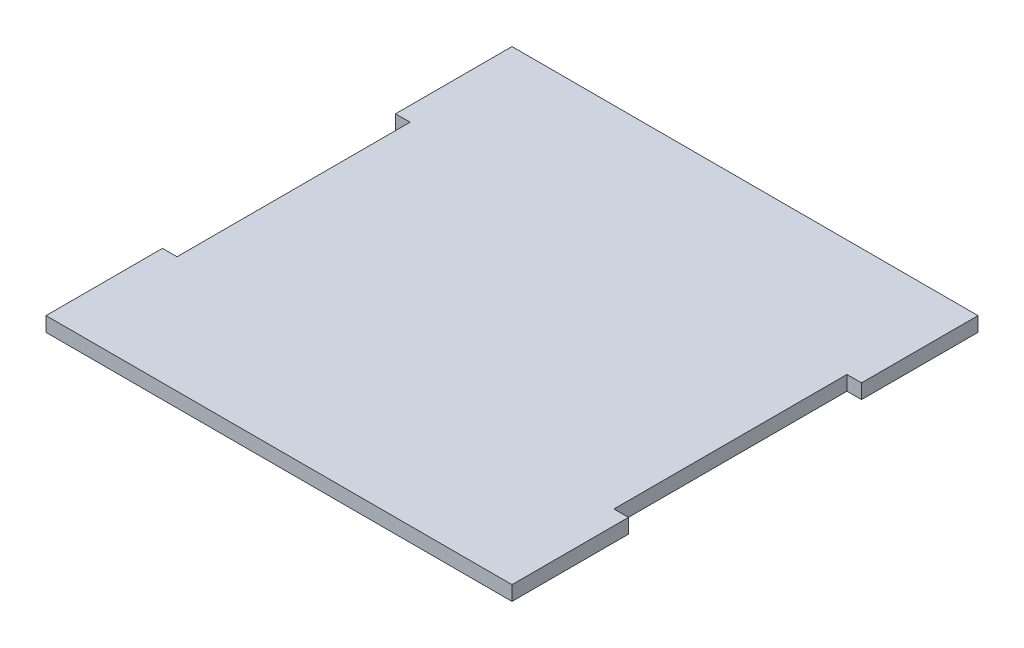
ISO-10303-21;
HEADER;
FILE_DESCRIPTION(('STEP AP214'),'2;1');
FILE_NAME('part.step','',(''),(''),'','','');
FILE_SCHEMA(('AUTOMOTIVE_DESIGN { 1 0 10303 214 1 1 1 1 }'));
ENDSEC;
DATA;
#1=APPLICATION_CONTEXT('core data for automotive mechanical design processes');
#2=APPLICATION_PROTOCOL_DEFINITION('international standard','automotive_design',2000,#1);
#3=PRODUCT_CONTEXT('',#1,'mechanical');
#4=PRODUCT('Part','Part','',(#3));
#5=PRODUCT_RELATED_PRODUCT_CATEGORY('part','',(#4));
#6=PRODUCT_DEFINITION_FORMATION('','',#4);
#7=PRODUCT_DEFINITION_CONTEXT('part definition',#1,'design');
#8=PRODUCT_DEFINITION('design','',#6,#7);
#9=PRODUCT_DEFINITION_SHAPE('','',#8);
#10=(LENGTH_UNIT() NAMED_UNIT(*) SI_UNIT(.MILLI.,.METRE.));
#11=(NAMED_UNIT(*) PLANE_ANGLE_UNIT() SI_UNIT($,.RADIAN.));
#12=(NAMED_UNIT(*) SI_UNIT($,.STERADIAN.) SOLID_ANGLE_UNIT());
#13=UNCERTAINTY_MEASURE_WITH_UNIT(LENGTH_MEASURE(1.E-05),#10,'distance_accuracy_value','');
#14=(GEOMETRIC_REPRESENTATION_CONTEXT(3) GLOBAL_UNCERTAINTY_ASSIGNED_CONTEXT((#13)) GLOBAL_UNIT_ASSIGNED_CONTEXT((#10,
#11,#12)) REPRESENTATION_CONTEXT('',''));
#15=CARTESIAN_POINT('',(0.,0.,0.));
#16=DIRECTION('',(0.,0.,1.));
#17=DIRECTION('',(1.,0.,0.));
#18=AXIS2_PLACEMENT_3D('',#15,#16,#17);
#19=CARTESIAN_POINT('',(0.,3.175,-76.2));
#20=DIRECTION('',(0.,0.,1.));
#21=DIRECTION('',(1.,0.,0.));
#22=AXIS2_PLACEMENT_3D('',#19,#20,#21);
#23=PLANE('',#22);
#24=DIRECTION('',(-1.,0.,0.));
#25=VECTOR('',#24,1.);
#26=CARTESIAN_POINT('',(0.,0.,-76.2));
#27=LINE('',#26,#25);
#28=CARTESIAN_POINT('',(101.6,0.,-76.2));
#29=VERTEX_POINT('',#28);
#30=CARTESIAN_POINT('',(98.425,0.,-76.2));
#31=VERTEX_POINT('',#30);
#32=EDGE_CURVE('E154',#29,#31,#27,.T.);
#33=ORIENTED_EDGE('',*,*,#32,.F.);
#34=DIRECTION('',(0.,-1.,0.));
#35=VECTOR('',#34,1.);
#36=CARTESIAN_POINT('',(101.6,3.175,-76.2));
#37=LINE('',#36,#35);
#38=CARTESIAN_POINT('',(101.6,3.175,-76.2));
#39=VERTEX_POINT('',#38);
#40=EDGE_CURVE('E11',#39,#29,#37,.T.);
#41=ORIENTED_EDGE('',*,*,#40,.F.);
#42=DIRECTION('',(-1.,0.,0.));
#43=VECTOR('',#42,1.);
#44=CARTESIAN_POINT('',(0.,3.175,-76.2));
#45=LINE('',#44,#43);
#46=CARTESIAN_POINT('',(98.425,3.175,-76.2));
#47=VERTEX_POINT('',#46);
#48=EDGE_CURVE('E182',#39,#47,#45,.T.);
#49=ORIENTED_EDGE('',*,*,#48,.T.);
#50=DIRECTION('',(0.,-1.,0.));
#51=VECTOR('',#50,1.);
#52=CARTESIAN_POINT('',(98.425,3.175,-76.2));
#53=LINE('',#52,#51);
#54=EDGE_CURVE('E98',#47,#31,#53,.T.);
#55=ORIENTED_EDGE('',*,*,#54,.T.);
#56=EDGE_LOOP('',(#33,#41,#49,#55));
#57=FACE_BOUND('',#56,.T.);
#58=ADVANCED_FACE('F35',(#57),#23,.T.);
#59=CARTESIAN_POINT('',(101.6,3.175,0.));
#60=DIRECTION('',(-1.,0.,0.));
#61=DIRECTION('',(0.,0.,1.));
#62=AXIS2_PLACEMENT_3D('',#59,#60,#61);
#63=PLANE('',#62);
#64=DIRECTION('',(0.,0.,-1.));
#65=VECTOR('',#64,1.);
#66=CARTESIAN_POINT('',(101.6,0.,0.));
#67=LINE('',#66,#65);
#68=CARTESIAN_POINT('',(101.6,0.,-101.6));
#69=VERTEX_POINT('',#68);
#70=EDGE_CURVE('E157',#29,#69,#67,.T.);
#71=ORIENTED_EDGE('',*,*,#70,.T.);
#72=DIRECTION('',(0.,-1.,0.));
#73=VECTOR('',#72,1.);
#74=CARTESIAN_POINT('',(101.6,3.175,-101.6));
#75=LINE('',#74,#73);
#76=CARTESIAN_POINT('',(101.6,3.175,-101.6));
#77=VERTEX_POINT('',#76);
#78=EDGE_CURVE('E43',#77,#69,#75,.T.);
#79=ORIENTED_EDGE('',*,*,#78,.F.);
#80=DIRECTION('',(0.,0.,-1.));
#81=VECTOR('',#80,1.);
#82=CARTESIAN_POINT('',(101.6,3.175,0.));
#83=LINE('',#82,#81);
#84=EDGE_CURVE('E140',#39,#77,#83,.T.);
#85=ORIENTED_EDGE('',*,*,#84,.F.);
#86=ORIENTED_EDGE('',*,*,#40,.T.);
#87=EDGE_LOOP('',(#71,#79,#85,#86));
#88=FACE_BOUND('',#87,.T.);
#89=ADVANCED_FACE('F206',(#88),#63,.F.);
#90=CARTESIAN_POINT('',(0.,3.175,-101.6));
#91=DIRECTION('',(0.,0.,-1.));
#92=DIRECTION('',(-1.,0.,0.));
#93=AXIS2_PLACEMENT_3D('',#90,#91,#92);
#94=PLANE('',#93);
#95=DIRECTION('',(1.,0.,0.));
#96=VECTOR('',#95,1.);
#97=CARTESIAN_POINT('',(0.,0.,-101.6));
#98=LINE('',#97,#96);
#99=CARTESIAN_POINT('',(0.,0.,-101.6));
#100=VERTEX_POINT('',#99);
#101=EDGE_CURVE('E160',#100,#69,#98,.T.);
#102=ORIENTED_EDGE('',*,*,#101,.F.);
#103=DIRECTION('',(0.,-1.,0.));
#104=VECTOR('',#103,1.);
#105=CARTESIAN_POINT('',(0.,3.175,-101.6));
#106=LINE('',#105,#104);
#107=CARTESIAN_POINT('',(0.,3.175,-101.6));
#108=VERTEX_POINT('',#107);
#109=EDGE_CURVE('E196',#108,#100,#106,.T.);
#110=ORIENTED_EDGE('',*,*,#109,.F.);
#111=DIRECTION('',(1.,0.,0.));
#112=VECTOR('',#111,1.);
#113=CARTESIAN_POINT('',(0.,3.175,-101.6));
#114=LINE('',#113,#112);
#115=EDGE_CURVE('E203',#108,#77,#114,.T.);
#116=ORIENTED_EDGE('',*,*,#115,.T.);
#117=ORIENTED_EDGE('',*,*,#78,.T.);
#118=EDGE_LOOP('',(#102,#110,#116,#117));
#119=FACE_BOUND('',#118,.T.);
#120=ADVANCED_FACE('F201',(#119),#94,.T.);
#121=CARTESIAN_POINT('',(0.,3.175,0.));
#122=DIRECTION('',(-1.,0.,0.));
#123=DIRECTION('',(0.,0.,1.));
#124=AXIS2_PLACEMENT_3D('',#121,#122,#123);
#125=PLANE('',#124);
#126=DIRECTION('',(0.,0.,-1.));
#127=VECTOR('',#126,1.);
#128=CARTESIAN_POINT('',(0.,0.,0.));
#129=LINE('',#128,#127);
#130=CARTESIAN_POINT('',(0.,0.,-76.2));
#131=VERTEX_POINT('',#130);
#132=EDGE_CURVE('E163',#131,#100,#129,.T.);
#133=ORIENTED_EDGE('',*,*,#132,.F.);
#134=DIRECTION('',(0.,-1.,0.));
#135=VECTOR('',#134,1.);
#136=CARTESIAN_POINT('',(0.,3.175,-76.2));
#137=LINE('',#136,#135);
#138=CARTESIAN_POINT('',(0.,3.175,-76.2));
#139=VERTEX_POINT('',#138);
#140=EDGE_CURVE('E194',#139,#131,#137,.T.);
#141=ORIENTED_EDGE('',*,*,#140,.F.);
#142=DIRECTION('',(0.,0.,-1.));
#143=VECTOR('',#142,1.);
#144=CARTESIAN_POINT('',(0.,3.175,0.));
#145=LINE('',#144,#143);
#146=EDGE_CURVE('E216',#139,#108,#145,.T.);
#147=ORIENTED_EDGE('',*,*,#146,.T.);
#148=ORIENTED_EDGE('',*,*,#109,.T.);
#149=EDGE_LOOP('',(#133,#141,#147,#148));
#150=FACE_BOUND('',#149,.T.);
#151=ADVANCED_FACE('F212',(#150),#125,.T.);
#152=CARTESIAN_POINT('',(0.,3.175,-76.2));
#153=DIRECTION('',(0.,0.,-1.));
#154=DIRECTION('',(-1.,0.,0.));
#155=AXIS2_PLACEMENT_3D('',#152,#153,#154);
#156=PLANE('',#155);
#157=DIRECTION('',(1.,0.,0.));
#158=VECTOR('',#157,1.);
#159=CARTESIAN_POINT('',(0.,0.,-76.2));
#160=LINE('',#159,#158);
#161=CARTESIAN_POINT('',(3.175,0.,-76.2));
#162=VERTEX_POINT('',#161);
#163=EDGE_CURVE('E166',#131,#162,#160,.T.);
#164=ORIENTED_EDGE('',*,*,#163,.T.);
#165=DIRECTION('',(0.,-1.,0.));
#166=VECTOR('',#165,1.);
#167=CARTESIAN_POINT('',(3.175,3.175,-76.2));
#168=LINE('',#167,#166);
#169=CARTESIAN_POINT('',(3.175,3.175,-76.2));
#170=VERTEX_POINT('',#169);
#171=EDGE_CURVE('E192',#170,#162,#168,.T.);
#172=ORIENTED_EDGE('',*,*,#171,.F.);
#173=DIRECTION('',(1.,0.,0.));
#174=VECTOR('',#173,1.);
#175=CARTESIAN_POINT('',(0.,3.175,-76.2));
#176=LINE('',#175,#174);
#177=EDGE_CURVE('E218',#139,#170,#176,.T.);
#178=ORIENTED_EDGE('',*,*,#177,.F.);
#179=ORIENTED_EDGE('',*,*,#140,.T.);
#180=EDGE_LOOP('',(#164,#172,#178,#179));
#181=FACE_BOUND('',#180,.T.);
#182=ADVANCED_FACE('F267',(#181),#156,.F.);
#183=CARTESIAN_POINT('',(3.175,3.175,0.));
#184=DIRECTION('',(-1.,0.,0.));
#185=DIRECTION('',(0.,0.,1.));
#186=AXIS2_PLACEMENT_3D('',#183,#184,#185);
#187=PLANE('',#186);
#188=DIRECTION('',(0.,0.,-1.));
#189=VECTOR('',#188,1.);
#190=CARTESIAN_POINT('',(3.175,0.,0.));
#191=LINE('',#190,#189);
#192=CARTESIAN_POINT('',(3.175,0.,-25.4));
#193=VERTEX_POINT('',#192);
#194=EDGE_CURVE('E170',#193,#162,#191,.T.);
#195=ORIENTED_EDGE('',*,*,#194,.F.);
#196=DIRECTION('',(0.,-1.,0.));
#197=VECTOR('',#196,1.);
#198=CARTESIAN_POINT('',(3.175,3.175,-25.4));
#199=LINE('',#198,#197);
#200=CARTESIAN_POINT('',(3.175,3.175,-25.4));
#201=VERTEX_POINT('',#200);
#202=EDGE_CURVE('E190',#201,#193,#199,.T.);
#203=ORIENTED_EDGE('',*,*,#202,.F.);
#204=DIRECTION('',(0.,0.,-1.));
#205=VECTOR('',#204,1.);
#206=CARTESIAN_POINT('',(3.175,3.175,0.));
#207=LINE('',#206,#205);
#208=EDGE_CURVE('E224',#201,#170,#207,.T.);
#209=ORIENTED_EDGE('',*,*,#208,.T.);
#210=ORIENTED_EDGE('',*,*,#171,.T.);
#211=EDGE_LOOP('',(#195,#203,#209,#210));
#212=FACE_BOUND('',#211,.T.);
#213=ADVANCED_FACE('F264',(#212),#187,.T.);
#214=CARTESIAN_POINT('',(0.,3.175,-25.4));
#215=DIRECTION('',(0.,0.,-1.));
#216=DIRECTION('',(-1.,0.,0.));
#217=AXIS2_PLACEMENT_3D('',#214,#215,#216);
#218=PLANE('',#217);
#219=DIRECTION('',(1.,0.,0.));
#220=VECTOR('',#219,1.);
#221=CARTESIAN_POINT('',(0.,0.,-25.4));
#222=LINE('',#221,#220);
#223=CARTESIAN_POINT('',(0.,0.,-25.4));
#224=VERTEX_POINT('',#223);
#225=EDGE_CURVE('E173',#224,#193,#222,.T.);
#226=ORIENTED_EDGE('',*,*,#225,.F.);
#227=DIRECTION('',(0.,-1.,0.));
#228=VECTOR('',#227,1.);
#229=CARTESIAN_POINT('',(0.,3.175,-25.4));
#230=LINE('',#229,#228);
#231=CARTESIAN_POINT('',(0.,3.175,-25.4));
#232=VERTEX_POINT('',#231);
#233=EDGE_CURVE('E188',#232,#224,#230,.T.);
#234=ORIENTED_EDGE('',*,*,#233,.F.);
#235=DIRECTION('',(1.,0.,0.));
#236=VECTOR('',#235,1.);
#237=CARTESIAN_POINT('',(0.,3.175,-25.4));
#238=LINE('',#237,#236);
#239=EDGE_CURVE('E226',#232,#201,#238,.T.);
#240=ORIENTED_EDGE('',*,*,#239,.T.);
#241=ORIENTED_EDGE('',*,*,#202,.T.);
#242=EDGE_LOOP('',(#226,#234,#240,#241));
#243=FACE_BOUND('',#242,.T.);
#244=ADVANCED_FACE('F259',(#243),#218,.T.);
#245=CARTESIAN_POINT('',(0.,0.,0.));
#246=VERTEX_POINT('',#245);
#247=EDGE_CURVE('E167',#246,#224,#129,.T.);
#248=ORIENTED_EDGE('',*,*,#247,.F.);
#249=DIRECTION('',(0.,-1.,0.));
#250=VECTOR('',#249,1.);
#251=CARTESIAN_POINT('',(0.,3.175,0.));
#252=LINE('',#251,#250);
#253=CARTESIAN_POINT('',(0.,3.175,0.));
#254=VERTEX_POINT('',#253);
#255=EDGE_CURVE('E186',#254,#246,#252,.T.);
#256=ORIENTED_EDGE('',*,*,#255,.F.);
#257=EDGE_CURVE('E220',#254,#232,#145,.T.);
#258=ORIENTED_EDGE('',*,*,#257,.T.);
#259=ORIENTED_EDGE('',*,*,#233,.T.);
#260=EDGE_LOOP('',(#248,#256,#258,#259));
#261=FACE_BOUND('',#260,.T.);
#262=ADVANCED_FACE('F255',(#261),#125,.T.);
#263=CARTESIAN_POINT('',(0.,3.175,0.));
#264=DIRECTION('',(0.,0.,1.));
#265=DIRECTION('',(1.,0.,0.));
#266=AXIS2_PLACEMENT_3D('',#263,#264,#265);
#267=PLANE('',#266);
#268=DIRECTION('',(-1.,0.,0.));
#269=VECTOR('',#268,1.);
#270=CARTESIAN_POINT('',(0.,0.,0.));
#271=LINE('',#270,#269);
#272=CARTESIAN_POINT('',(101.6,0.,0.));
#273=VERTEX_POINT('',#272);
#274=EDGE_CURVE('E176',#273,#246,#271,.T.);
#275=ORIENTED_EDGE('',*,*,#274,.F.);
#276=DIRECTION('',(0.,-1.,0.));
#277=VECTOR('',#276,1.);
#278=CARTESIAN_POINT('',(101.6,3.175,0.));
#279=LINE('',#278,#277);
#280=CARTESIAN_POINT('',(101.6,3.175,0.));
#281=VERTEX_POINT('',#280);
#282=EDGE_CURVE('E145',#281,#273,#279,.T.);
#283=ORIENTED_EDGE('',*,*,#282,.F.);
#284=DIRECTION('',(-1.,0.,0.));
#285=VECTOR('',#284,1.);
#286=CARTESIAN_POINT('',(0.,3.175,0.));
#287=LINE('',#286,#285);
#288=EDGE_CURVE('E137',#281,#254,#287,.T.);
#289=ORIENTED_EDGE('',*,*,#288,.T.);
#290=ORIENTED_EDGE('',*,*,#255,.T.);
#291=EDGE_LOOP('',(#275,#283,#289,#290));
#292=FACE_BOUND('',#291,.T.);
#293=ADVANCED_FACE('F234',(#292),#267,.T.);
#294=CARTESIAN_POINT('',(101.6,0.,-25.4));
#295=VERTEX_POINT('',#294);
#296=EDGE_CURVE('E144',#273,#295,#67,.T.);
#297=ORIENTED_EDGE('',*,*,#296,.T.);
#298=DIRECTION('',(0.,-1.,0.));
#299=VECTOR('',#298,1.);
#300=CARTESIAN_POINT('',(101.6,3.175,-25.4));
#301=LINE('',#300,#299);
#302=CARTESIAN_POINT('',(101.6,3.175,-25.4));
#303=VERTEX_POINT('',#302);
#304=EDGE_CURVE('E141',#303,#295,#301,.T.);
#305=ORIENTED_EDGE('',*,*,#304,.F.);
#306=EDGE_CURVE('E130',#281,#303,#83,.T.);
#307=ORIENTED_EDGE('',*,*,#306,.F.);
#308=ORIENTED_EDGE('',*,*,#282,.T.);
#309=EDGE_LOOP('',(#297,#305,#307,#308));
#310=FACE_BOUND('',#309,.T.);
#311=ADVANCED_FACE('F142',(#310),#63,.F.);
#312=CARTESIAN_POINT('',(0.,3.175,-25.4));
#313=DIRECTION('',(0.,0.,1.));
#314=DIRECTION('',(1.,0.,0.));
#315=AXIS2_PLACEMENT_3D('',#312,#313,#314);
#316=PLANE('',#315);
#317=DIRECTION('',(-1.,0.,0.));
#318=VECTOR('',#317,1.);
#319=CARTESIAN_POINT('',(0.,0.,-25.4));
#320=LINE('',#319,#318);
#321=CARTESIAN_POINT('',(98.425,0.,-25.4));
#322=VERTEX_POINT('',#321);
#323=EDGE_CURVE('E91',#295,#322,#320,.T.);
#324=ORIENTED_EDGE('',*,*,#323,.T.);
#325=DIRECTION('',(0.,-1.,0.));
#326=VECTOR('',#325,1.);
#327=CARTESIAN_POINT('',(98.425,3.175,-25.4));
#328=LINE('',#327,#326);
#329=CARTESIAN_POINT('',(98.425,3.175,-25.4));
#330=VERTEX_POINT('',#329);
#331=EDGE_CURVE('E146',#330,#322,#328,.T.);
#332=ORIENTED_EDGE('',*,*,#331,.F.);
#333=DIRECTION('',(-1.,0.,0.));
#334=VECTOR('',#333,1.);
#335=CARTESIAN_POINT('',(0.,3.175,-25.4));
#336=LINE('',#335,#334);
#337=EDGE_CURVE('E134',#303,#330,#336,.T.);
#338=ORIENTED_EDGE('',*,*,#337,.F.);
#339=ORIENTED_EDGE('',*,*,#304,.T.);
#340=EDGE_LOOP('',(#324,#332,#338,#339));
#341=FACE_BOUND('',#340,.T.);
#342=ADVANCED_FACE('F148',(#341),#316,.F.);
#343=CARTESIAN_POINT('',(98.425,3.175,0.));
#344=DIRECTION('',(-1.,0.,0.));
#345=DIRECTION('',(0.,0.,1.));
#346=AXIS2_PLACEMENT_3D('',#343,#344,#345);
#347=PLANE('',#346);
#348=DIRECTION('',(0.,0.,-1.));
#349=VECTOR('',#348,1.);
#350=CARTESIAN_POINT('',(98.425,0.,0.));
#351=LINE('',#350,#349);
#352=EDGE_CURVE('E180',#322,#31,#351,.T.);
#353=ORIENTED_EDGE('',*,*,#352,.T.);
#354=ORIENTED_EDGE('',*,*,#54,.F.);
#355=DIRECTION('',(0.,0.,-1.));
#356=VECTOR('',#355,1.);
#357=CARTESIAN_POINT('',(98.425,3.175,0.));
#358=LINE('',#357,#356);
#359=EDGE_CURVE('E51',#330,#47,#358,.T.);
#360=ORIENTED_EDGE('',*,*,#359,.F.);
#361=ORIENTED_EDGE('',*,*,#331,.T.);
#362=EDGE_LOOP('',(#353,#354,#360,#361));
#363=FACE_BOUND('',#362,.T.);
#364=ADVANCED_FACE('F239',(#363),#347,.F.);
#365=CARTESIAN_POINT('',(0.,3.175,0.));
#366=DIRECTION('',(0.,1.,0.));
#367=DIRECTION('',(0.,0.,1.));
#368=AXIS2_PLACEMENT_3D('',#365,#366,#367);
#369=PLANE('',#368);
#370=ORIENTED_EDGE('',*,*,#48,.F.);
#371=ORIENTED_EDGE('',*,*,#84,.T.);
#372=ORIENTED_EDGE('',*,*,#115,.F.);
#373=ORIENTED_EDGE('',*,*,#146,.F.);
#374=ORIENTED_EDGE('',*,*,#177,.T.);
#375=ORIENTED_EDGE('',*,*,#208,.F.);
#376=ORIENTED_EDGE('',*,*,#239,.F.);
#377=ORIENTED_EDGE('',*,*,#257,.F.);
#378=ORIENTED_EDGE('',*,*,#288,.F.);
#379=ORIENTED_EDGE('',*,*,#306,.T.);
#380=ORIENTED_EDGE('',*,*,#337,.T.);
#381=ORIENTED_EDGE('',*,*,#359,.T.);
#382=EDGE_LOOP('',(#370,#371,#372,#373,#374,#375,#376,#377,#378,#379,#380,#381));
#383=FACE_BOUND('',#382,.T.);
#384=ADVANCED_FACE('F132',(#383),#369,.T.);
#385=CARTESIAN_POINT('',(0.,0.,0.));
#386=DIRECTION('',(0.,1.,0.));
#387=DIRECTION('',(0.,0.,1.));
#388=AXIS2_PLACEMENT_3D('',#385,#386,#387);
#389=PLANE('',#388);
#390=ORIENTED_EDGE('',*,*,#32,.T.);
#391=ORIENTED_EDGE('',*,*,#352,.F.);
#392=ORIENTED_EDGE('',*,*,#323,.F.);
#393=ORIENTED_EDGE('',*,*,#296,.F.);
#394=ORIENTED_EDGE('',*,*,#274,.T.);
#395=ORIENTED_EDGE('',*,*,#247,.T.);
#396=ORIENTED_EDGE('',*,*,#225,.T.);
#397=ORIENTED_EDGE('',*,*,#194,.T.);
#398=ORIENTED_EDGE('',*,*,#163,.F.);
#399=ORIENTED_EDGE('',*,*,#132,.T.);
#400=ORIENTED_EDGE('',*,*,#101,.T.);
#401=ORIENTED_EDGE('',*,*,#70,.F.);
#402=EDGE_LOOP('',(#390,#391,#392,#393,#394,#395,#396,#397,#398,#399,#400,#401));
#403=FACE_BOUND('',#402,.T.);
#404=ADVANCED_FACE('F208',(#403),#389,.F.);
#405=CLOSED_SHELL('',(#58,#89,#120,#151,#182,#213,#244,#262,#293,#311,#342,#364,#384,#404));
#406=MANIFOLD_SOLID_BREP('B2',#405);
#407=ADVANCED_BREP_SHAPE_REPRESENTATION('',(#18,#406),#14);
#408=SHAPE_DEFINITION_REPRESENTATION(#9,#407);
ENDSEC;
END-ISO-10303-21;
